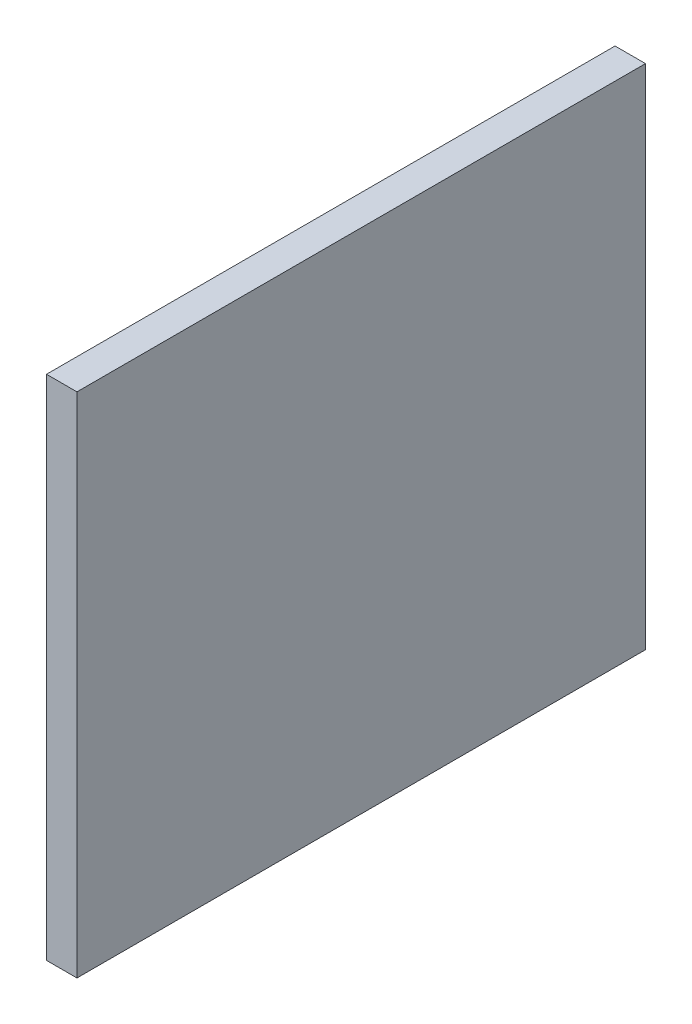
ISO-10303-21;
HEADER;
FILE_DESCRIPTION(('STEP AP214'),'2;1');
FILE_NAME('part.step','',(''),(''),'','','');
FILE_SCHEMA(('AUTOMOTIVE_DESIGN { 1 0 10303 214 1 1 1 1 }'));
ENDSEC;
DATA;
#1=APPLICATION_CONTEXT('core data for automotive mechanical design processes');
#2=APPLICATION_PROTOCOL_DEFINITION('international standard','automotive_design',2000,#1);
#3=PRODUCT_CONTEXT('',#1,'mechanical');
#4=PRODUCT('Part','Part','',(#3));
#5=PRODUCT_RELATED_PRODUCT_CATEGORY('part','',(#4));
#6=PRODUCT_DEFINITION_FORMATION('','',#4);
#7=PRODUCT_DEFINITION_CONTEXT('part definition',#1,'design');
#8=PRODUCT_DEFINITION('design','',#6,#7);
#9=PRODUCT_DEFINITION_SHAPE('','',#8);
#10=(LENGTH_UNIT() NAMED_UNIT(*) SI_UNIT(.MILLI.,.METRE.));
#11=(NAMED_UNIT(*) PLANE_ANGLE_UNIT() SI_UNIT($,.RADIAN.));
#12=(NAMED_UNIT(*) SI_UNIT($,.STERADIAN.) SOLID_ANGLE_UNIT());
#13=UNCERTAINTY_MEASURE_WITH_UNIT(LENGTH_MEASURE(1.E-05),#10,'distance_accuracy_value','');
#14=(GEOMETRIC_REPRESENTATION_CONTEXT(3) GLOBAL_UNCERTAINTY_ASSIGNED_CONTEXT((#13)) GLOBAL_UNIT_ASSIGNED_CONTEXT((#10,
#11,#12)) REPRESENTATION_CONTEXT('',''));
#15=CARTESIAN_POINT('',(0.,0.,0.));
#16=DIRECTION('',(0.,0.,1.));
#17=DIRECTION('',(1.,0.,0.));
#18=AXIS2_PLACEMENT_3D('',#15,#16,#17);
#19=CARTESIAN_POINT('',(3.,25.,-28.));
#20=DIRECTION('',(0.,0.,1.));
#21=DIRECTION('',(1.,0.,0.));
#22=AXIS2_PLACEMENT_3D('',#19,#20,#21);
#23=PLANE('',#22);
#24=DIRECTION('',(0.,1.,0.));
#25=VECTOR('',#24,1.);
#26=CARTESIAN_POINT('',(0.,25.,-28.));
#27=LINE('',#26,#25);
#28=CARTESIAN_POINT('',(0.,-25.,-28.));
#29=VERTEX_POINT('',#28);
#30=CARTESIAN_POINT('',(0.,25.,-28.));
#31=VERTEX_POINT('',#30);
#32=EDGE_CURVE('E98',#29,#31,#27,.T.);
#33=ORIENTED_EDGE('',*,*,#32,.T.);
#34=DIRECTION('',(-1.,0.,0.));
#35=VECTOR('',#34,1.);
#36=CARTESIAN_POINT('',(3.,25.,-28.));
#37=LINE('',#36,#35);
#38=CARTESIAN_POINT('',(3.,25.,-28.));
#39=VERTEX_POINT('',#38);
#40=EDGE_CURVE('E11',#39,#31,#37,.T.);
#41=ORIENTED_EDGE('',*,*,#40,.F.);
#42=DIRECTION('',(0.,1.,0.));
#43=VECTOR('',#42,1.);
#44=CARTESIAN_POINT('',(3.,25.,-28.));
#45=LINE('',#44,#43);
#46=CARTESIAN_POINT('',(3.,-25.,-28.));
#47=VERTEX_POINT('',#46);
#48=EDGE_CURVE('E86',#47,#39,#45,.T.);
#49=ORIENTED_EDGE('',*,*,#48,.F.);
#50=DIRECTION('',(-1.,0.,0.));
#51=VECTOR('',#50,1.);
#52=CARTESIAN_POINT('',(3.,-25.,-28.));
#53=LINE('',#52,#51);
#54=EDGE_CURVE('E94',#47,#29,#53,.T.);
#55=ORIENTED_EDGE('',*,*,#54,.T.);
#56=EDGE_LOOP('',(#33,#41,#49,#55));
#57=FACE_BOUND('',#56,.T.);
#58=ADVANCED_FACE('F35',(#57),#23,.F.);
#59=CARTESIAN_POINT('',(3.,25.,28.));
#60=DIRECTION('',(0.,-1.,0.));
#61=DIRECTION('',(0.,0.,-1.));
#62=AXIS2_PLACEMENT_3D('',#59,#60,#61);
#63=PLANE('',#62);
#64=DIRECTION('',(0.,0.,1.));
#65=VECTOR('',#64,1.);
#66=CARTESIAN_POINT('',(0.,25.,28.));
#67=LINE('',#66,#65);
#68=CARTESIAN_POINT('',(0.,25.,28.));
#69=VERTEX_POINT('',#68);
#70=EDGE_CURVE('E90',#31,#69,#67,.T.);
#71=ORIENTED_EDGE('',*,*,#70,.T.);
#72=DIRECTION('',(-1.,0.,0.));
#73=VECTOR('',#72,1.);
#74=CARTESIAN_POINT('',(3.,25.,28.));
#75=LINE('',#74,#73);
#76=CARTESIAN_POINT('',(3.,25.,28.));
#77=VERTEX_POINT('',#76);
#78=EDGE_CURVE('E43',#77,#69,#75,.T.);
#79=ORIENTED_EDGE('',*,*,#78,.F.);
#80=DIRECTION('',(0.,0.,1.));
#81=VECTOR('',#80,1.);
#82=CARTESIAN_POINT('',(3.,25.,28.));
#83=LINE('',#82,#81);
#84=EDGE_CURVE('E81',#39,#77,#83,.T.);
#85=ORIENTED_EDGE('',*,*,#84,.F.);
#86=ORIENTED_EDGE('',*,*,#40,.T.);
#87=EDGE_LOOP('',(#71,#79,#85,#86));
#88=FACE_BOUND('',#87,.T.);
#89=ADVANCED_FACE('F89',(#88),#63,.F.);
#90=CARTESIAN_POINT('',(3.,25.,28.));
#91=DIRECTION('',(0.,0.,-1.));
#92=DIRECTION('',(-1.,0.,0.));
#93=AXIS2_PLACEMENT_3D('',#90,#91,#92);
#94=PLANE('',#93);
#95=DIRECTION('',(0.,-1.,0.));
#96=VECTOR('',#95,1.);
#97=CARTESIAN_POINT('',(0.,25.,28.));
#98=LINE('',#97,#96);
#99=CARTESIAN_POINT('',(0.,-25.,28.));
#100=VERTEX_POINT('',#99);
#101=EDGE_CURVE('E68',#69,#100,#98,.T.);
#102=ORIENTED_EDGE('',*,*,#101,.T.);
#103=DIRECTION('',(-1.,0.,0.));
#104=VECTOR('',#103,1.);
#105=CARTESIAN_POINT('',(3.,-25.,28.));
#106=LINE('',#105,#104);
#107=CARTESIAN_POINT('',(3.,-25.,28.));
#108=VERTEX_POINT('',#107);
#109=EDGE_CURVE('E91',#108,#100,#106,.T.);
#110=ORIENTED_EDGE('',*,*,#109,.F.);
#111=DIRECTION('',(0.,-1.,0.));
#112=VECTOR('',#111,1.);
#113=CARTESIAN_POINT('',(3.,25.,28.));
#114=LINE('',#113,#112);
#115=EDGE_CURVE('E84',#77,#108,#114,.T.);
#116=ORIENTED_EDGE('',*,*,#115,.F.);
#117=ORIENTED_EDGE('',*,*,#78,.T.);
#118=EDGE_LOOP('',(#102,#110,#116,#117));
#119=FACE_BOUND('',#118,.T.);
#120=ADVANCED_FACE('F92',(#119),#94,.F.);
#121=CARTESIAN_POINT('',(3.,-25.,28.));
#122=DIRECTION('',(0.,1.,0.));
#123=DIRECTION('',(0.,0.,1.));
#124=AXIS2_PLACEMENT_3D('',#121,#122,#123);
#125=PLANE('',#124);
#126=DIRECTION('',(0.,0.,-1.));
#127=VECTOR('',#126,1.);
#128=CARTESIAN_POINT('',(0.,-25.,28.));
#129=LINE('',#128,#127);
#130=EDGE_CURVE('E74',#100,#29,#129,.T.);
#131=ORIENTED_EDGE('',*,*,#130,.T.);
#132=ORIENTED_EDGE('',*,*,#54,.F.);
#133=DIRECTION('',(0.,0.,-1.));
#134=VECTOR('',#133,1.);
#135=CARTESIAN_POINT('',(3.,-25.,28.));
#136=LINE('',#135,#134);
#137=EDGE_CURVE('E51',#108,#47,#136,.T.);
#138=ORIENTED_EDGE('',*,*,#137,.F.);
#139=ORIENTED_EDGE('',*,*,#109,.T.);
#140=EDGE_LOOP('',(#131,#132,#138,#139));
#141=FACE_BOUND('',#140,.T.);
#142=ADVANCED_FACE('F105',(#141),#125,.F.);
#143=CARTESIAN_POINT('',(3.,0.,0.));
#144=DIRECTION('',(1.,0.,0.));
#145=DIRECTION('',(0.,0.,-1.));
#146=AXIS2_PLACEMENT_3D('',#143,#144,#145);
#147=PLANE('',#146);
#148=ORIENTED_EDGE('',*,*,#48,.T.);
#149=ORIENTED_EDGE('',*,*,#84,.T.);
#150=ORIENTED_EDGE('',*,*,#115,.T.);
#151=ORIENTED_EDGE('',*,*,#137,.T.);
#152=EDGE_LOOP('',(#148,#149,#150,#151));
#153=FACE_BOUND('',#152,.T.);
#154=ADVANCED_FACE('F82',(#153),#147,.T.);
#155=CARTESIAN_POINT('',(0.,0.,0.));
#156=DIRECTION('',(1.,0.,0.));
#157=DIRECTION('',(0.,0.,-1.));
#158=AXIS2_PLACEMENT_3D('',#155,#156,#157);
#159=PLANE('',#158);
#160=ORIENTED_EDGE('',*,*,#32,.F.);
#161=ORIENTED_EDGE('',*,*,#130,.F.);
#162=ORIENTED_EDGE('',*,*,#101,.F.);
#163=ORIENTED_EDGE('',*,*,#70,.F.);
#164=EDGE_LOOP('',(#160,#161,#162,#163));
#165=FACE_BOUND('',#164,.T.);
#166=ADVANCED_FACE('F108',(#165),#159,.F.);
#167=CLOSED_SHELL('',(#58,#89,#120,#142,#154,#166));
#168=MANIFOLD_SOLID_BREP('B2',#167);
#169=ADVANCED_BREP_SHAPE_REPRESENTATION('',(#18,#168),#14);
#170=SHAPE_DEFINITION_REPRESENTATION(#9,#169);
ENDSEC;
END-ISO-10303-21;
